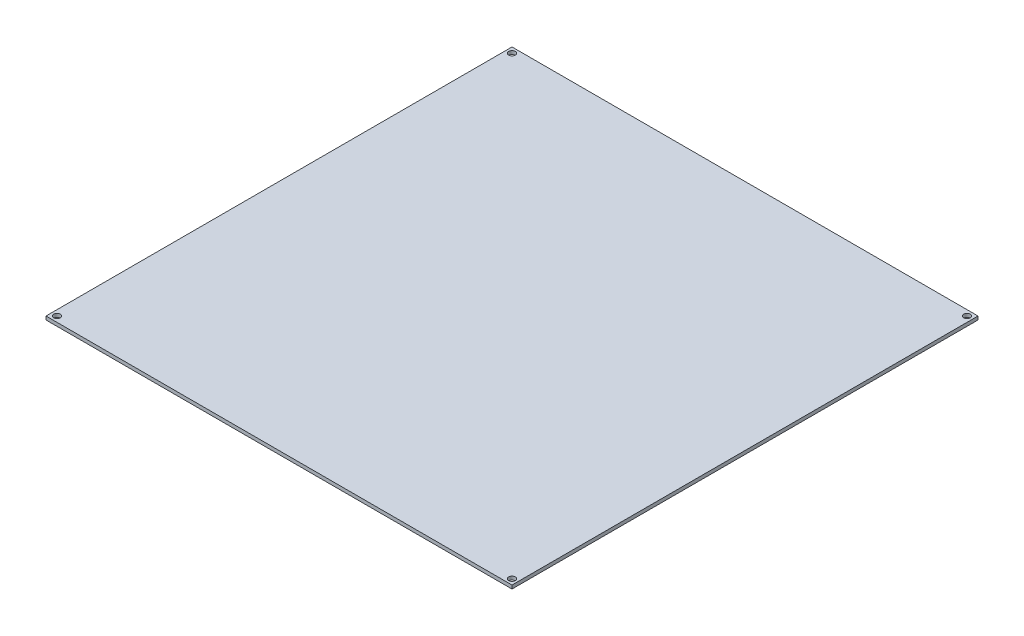
ISO-10303-21;
HEADER;
FILE_DESCRIPTION(('STEP AP214'),'2;1');
FILE_NAME('part.step','',(''),(''),'','','');
FILE_SCHEMA(('AUTOMOTIVE_DESIGN { 1 0 10303 214 1 1 1 1 }'));
ENDSEC;
DATA;
#1=APPLICATION_CONTEXT('core data for automotive mechanical design processes');
#2=APPLICATION_PROTOCOL_DEFINITION('international standard','automotive_design',2000,#1);
#3=PRODUCT_CONTEXT('',#1,'mechanical');
#4=PRODUCT('Part','Part','',(#3));
#5=PRODUCT_RELATED_PRODUCT_CATEGORY('part','',(#4));
#6=PRODUCT_DEFINITION_FORMATION('','',#4);
#7=PRODUCT_DEFINITION_CONTEXT('part definition',#1,'design');
#8=PRODUCT_DEFINITION('design','',#6,#7);
#9=PRODUCT_DEFINITION_SHAPE('','',#8);
#10=(LENGTH_UNIT() NAMED_UNIT(*) SI_UNIT(.MILLI.,.METRE.));
#11=(NAMED_UNIT(*) PLANE_ANGLE_UNIT() SI_UNIT($,.RADIAN.));
#12=(NAMED_UNIT(*) SI_UNIT($,.STERADIAN.) SOLID_ANGLE_UNIT());
#13=UNCERTAINTY_MEASURE_WITH_UNIT(LENGTH_MEASURE(1.E-05),#10,'distance_accuracy_value','');
#14=(GEOMETRIC_REPRESENTATION_CONTEXT(3) GLOBAL_UNCERTAINTY_ASSIGNED_CONTEXT((#13)) GLOBAL_UNIT_ASSIGNED_CONTEXT((#10,
#11,#12)) REPRESENTATION_CONTEXT('',''));
#15=CARTESIAN_POINT('',(0.,0.,0.));
#16=DIRECTION('',(0.,0.,1.));
#17=DIRECTION('',(1.,0.,0.));
#18=AXIS2_PLACEMENT_3D('',#15,#16,#17);
#19=CARTESIAN_POINT('',(0.,0.8,0.));
#20=DIRECTION('',(0.,1.,0.));
#21=DIRECTION('',(0.,0.,1.));
#22=AXIS2_PLACEMENT_3D('',#19,#20,#21);
#23=PLANE('',#22);
#24=CARTESIAN_POINT('',(-104.5,0.8,104.5));
#25=DIRECTION('',(0.,1.,0.));
#26=DIRECTION('',(0.,0.,-1.));
#27=AXIS2_PLACEMENT_3D('',#24,#25,#26);
#28=CIRCLE('',#27,1.5);
#29=CARTESIAN_POINT('',(-104.5,0.8,103.));
#30=VERTEX_POINT('',#29);
#31=EDGE_CURVE('E120',#30,#30,#28,.T.);
#32=ORIENTED_EDGE('',*,*,#31,.F.);
#33=EDGE_LOOP('',(#32));
#34=FACE_BOUND('',#33,.T.);
#35=CARTESIAN_POINT('',(-104.5,0.8,-104.5));
#36=DIRECTION('',(0.,1.,0.));
#37=DIRECTION('',(0.,0.,1.));
#38=AXIS2_PLACEMENT_3D('',#35,#36,#37);
#39=CIRCLE('',#38,1.5);
#40=CARTESIAN_POINT('',(-104.5,0.8,-103.));
#41=VERTEX_POINT('',#40);
#42=EDGE_CURVE('E99',#41,#41,#39,.T.);
#43=ORIENTED_EDGE('',*,*,#42,.F.);
#44=EDGE_LOOP('',(#43));
#45=FACE_BOUND('',#44,.T.);
#46=DIRECTION('',(0.,0.,1.));
#47=VECTOR('',#46,1.);
#48=CARTESIAN_POINT('',(-107.,0.8,-107.));
#49=LINE('',#48,#47);
#50=CARTESIAN_POINT('',(-107.,0.8,-107.));
#51=VERTEX_POINT('',#50);
#52=CARTESIAN_POINT('',(-107.,0.8,107.));
#53=VERTEX_POINT('',#52);
#54=EDGE_CURVE('E84',#51,#53,#49,.T.);
#55=ORIENTED_EDGE('',*,*,#54,.T.);
#56=DIRECTION('',(1.,0.,0.));
#57=VECTOR('',#56,1.);
#58=CARTESIAN_POINT('',(-107.,0.8,107.));
#59=LINE('',#58,#57);
#60=CARTESIAN_POINT('',(107.,0.8,107.));
#61=VERTEX_POINT('',#60);
#62=EDGE_CURVE('E79',#53,#61,#59,.T.);
#63=ORIENTED_EDGE('',*,*,#62,.T.);
#64=DIRECTION('',(0.,0.,-1.));
#65=VECTOR('',#64,1.);
#66=CARTESIAN_POINT('',(107.,0.8,-107.));
#67=LINE('',#66,#65);
#68=CARTESIAN_POINT('',(107.,0.8,-107.));
#69=VERTEX_POINT('',#68);
#70=EDGE_CURVE('E82',#61,#69,#67,.T.);
#71=ORIENTED_EDGE('',*,*,#70,.T.);
#72=DIRECTION('',(-1.,0.,0.));
#73=VECTOR('',#72,1.);
#74=CARTESIAN_POINT('',(-107.,0.8,-107.));
#75=LINE('',#74,#73);
#76=EDGE_CURVE('E49',#69,#51,#75,.T.);
#77=ORIENTED_EDGE('',*,*,#76,.T.);
#78=EDGE_LOOP('',(#55,#63,#71,#77));
#79=FACE_BOUND('',#78,.T.);
#80=CARTESIAN_POINT('',(104.5,0.8,-104.5));
#81=DIRECTION('',(0.,1.,0.));
#82=DIRECTION('',(0.,0.,-1.));
#83=AXIS2_PLACEMENT_3D('',#80,#81,#82);
#84=CIRCLE('',#83,1.5);
#85=CARTESIAN_POINT('',(104.5,0.8,-106.));
#86=VERTEX_POINT('',#85);
#87=EDGE_CURVE('E114',#86,#86,#84,.T.);
#88=ORIENTED_EDGE('',*,*,#87,.F.);
#89=EDGE_LOOP('',(#88));
#90=FACE_BOUND('',#89,.T.);
#91=CARTESIAN_POINT('',(104.5,0.8,104.5));
#92=DIRECTION('',(0.,1.,0.));
#93=DIRECTION('',(0.,0.,1.));
#94=AXIS2_PLACEMENT_3D('',#91,#92,#93);
#95=CIRCLE('',#94,1.5);
#96=CARTESIAN_POINT('',(104.5,0.8,106.));
#97=VERTEX_POINT('',#96);
#98=EDGE_CURVE('E126',#97,#97,#95,.T.);
#99=ORIENTED_EDGE('',*,*,#98,.F.);
#100=EDGE_LOOP('',(#99));
#101=FACE_BOUND('',#100,.T.);
#102=ADVANCED_FACE('F32',(#34,#45,#79,#90,#101),#23,.T.);
#103=CARTESIAN_POINT('',(0.,-0.8,0.));
#104=DIRECTION('',(0.,1.,0.));
#105=DIRECTION('',(0.,0.,1.));
#106=AXIS2_PLACEMENT_3D('',#103,#104,#105);
#107=PLANE('',#106);
#108=DIRECTION('',(0.,0.,1.));
#109=VECTOR('',#108,1.);
#110=CARTESIAN_POINT('',(-107.,-0.8,-107.));
#111=LINE('',#110,#109);
#112=CARTESIAN_POINT('',(-107.,-0.8,-107.));
#113=VERTEX_POINT('',#112);
#114=CARTESIAN_POINT('',(-107.,-0.8,107.));
#115=VERTEX_POINT('',#114);
#116=EDGE_CURVE('E96',#113,#115,#111,.T.);
#117=ORIENTED_EDGE('',*,*,#116,.F.);
#118=DIRECTION('',(-1.,0.,0.));
#119=VECTOR('',#118,1.);
#120=CARTESIAN_POINT('',(-107.,-0.8,-107.));
#121=LINE('',#120,#119);
#122=CARTESIAN_POINT('',(107.,-0.8,-107.));
#123=VERTEX_POINT('',#122);
#124=EDGE_CURVE('E72',#123,#113,#121,.T.);
#125=ORIENTED_EDGE('',*,*,#124,.F.);
#126=DIRECTION('',(0.,0.,-1.));
#127=VECTOR('',#126,1.);
#128=CARTESIAN_POINT('',(107.,-0.8,-107.));
#129=LINE('',#128,#127);
#130=CARTESIAN_POINT('',(107.,-0.8,107.));
#131=VERTEX_POINT('',#130);
#132=EDGE_CURVE('E66',#131,#123,#129,.T.);
#133=ORIENTED_EDGE('',*,*,#132,.F.);
#134=DIRECTION('',(1.,0.,0.));
#135=VECTOR('',#134,1.);
#136=CARTESIAN_POINT('',(-107.,-0.8,107.));
#137=LINE('',#136,#135);
#138=EDGE_CURVE('E88',#115,#131,#137,.T.);
#139=ORIENTED_EDGE('',*,*,#138,.F.);
#140=EDGE_LOOP('',(#117,#125,#133,#139));
#141=FACE_BOUND('',#140,.T.);
#142=CARTESIAN_POINT('',(-104.5,-0.8,-104.5));
#143=DIRECTION('',(0.,1.,0.));
#144=DIRECTION('',(0.,0.,1.));
#145=AXIS2_PLACEMENT_3D('',#142,#143,#144);
#146=CIRCLE('',#145,1.5);
#147=CARTESIAN_POINT('',(-104.5,-0.8,-103.));
#148=VERTEX_POINT('',#147);
#149=EDGE_CURVE('E111',#148,#148,#146,.T.);
#150=ORIENTED_EDGE('',*,*,#149,.T.);
#151=EDGE_LOOP('',(#150));
#152=FACE_BOUND('',#151,.T.);
#153=CARTESIAN_POINT('',(104.5,-0.8,-104.5));
#154=DIRECTION('',(0.,1.,0.));
#155=DIRECTION('',(0.,0.,-1.));
#156=AXIS2_PLACEMENT_3D('',#153,#154,#155);
#157=CIRCLE('',#156,1.5);
#158=CARTESIAN_POINT('',(104.5,-0.8,-106.));
#159=VERTEX_POINT('',#158);
#160=EDGE_CURVE('E117',#159,#159,#157,.T.);
#161=ORIENTED_EDGE('',*,*,#160,.T.);
#162=EDGE_LOOP('',(#161));
#163=FACE_BOUND('',#162,.T.);
#164=CARTESIAN_POINT('',(-104.5,-0.8,104.5));
#165=DIRECTION('',(0.,1.,0.));
#166=DIRECTION('',(0.,0.,-1.));
#167=AXIS2_PLACEMENT_3D('',#164,#165,#166);
#168=CIRCLE('',#167,1.5);
#169=CARTESIAN_POINT('',(-104.5,-0.8,103.));
#170=VERTEX_POINT('',#169);
#171=EDGE_CURVE('E123',#170,#170,#168,.T.);
#172=ORIENTED_EDGE('',*,*,#171,.T.);
#173=EDGE_LOOP('',(#172));
#174=FACE_BOUND('',#173,.T.);
#175=CARTESIAN_POINT('',(104.5,-0.8,104.5));
#176=DIRECTION('',(0.,1.,0.));
#177=DIRECTION('',(0.,0.,1.));
#178=AXIS2_PLACEMENT_3D('',#175,#176,#177);
#179=CIRCLE('',#178,1.5);
#180=CARTESIAN_POINT('',(104.5,-0.8,106.));
#181=VERTEX_POINT('',#180);
#182=EDGE_CURVE('E129',#181,#181,#179,.T.);
#183=ORIENTED_EDGE('',*,*,#182,.T.);
#184=EDGE_LOOP('',(#183));
#185=FACE_BOUND('',#184,.T.);
#186=ADVANCED_FACE('F107',(#141,#152,#163,#174,#185),#107,.F.);
#187=CARTESIAN_POINT('',(-107.,0.8,-107.));
#188=DIRECTION('',(1.,0.,0.));
#189=DIRECTION('',(0.,0.,-1.));
#190=AXIS2_PLACEMENT_3D('',#187,#188,#189);
#191=PLANE('',#190);
#192=ORIENTED_EDGE('',*,*,#116,.T.);
#193=DIRECTION('',(0.,-1.,0.));
#194=VECTOR('',#193,1.);
#195=CARTESIAN_POINT('',(-107.,0.8,107.));
#196=LINE('',#195,#194);
#197=EDGE_CURVE('E11',#53,#115,#196,.T.);
#198=ORIENTED_EDGE('',*,*,#197,.F.);
#199=ORIENTED_EDGE('',*,*,#54,.F.);
#200=DIRECTION('',(0.,-1.,0.));
#201=VECTOR('',#200,1.);
#202=CARTESIAN_POINT('',(-107.,0.8,-107.));
#203=LINE('',#202,#201);
#204=EDGE_CURVE('E92',#51,#113,#203,.T.);
#205=ORIENTED_EDGE('',*,*,#204,.T.);
#206=EDGE_LOOP('',(#192,#198,#199,#205));
#207=FACE_BOUND('',#206,.T.);
#208=ADVANCED_FACE('F34',(#207),#191,.F.);
#209=CARTESIAN_POINT('',(-107.,0.8,107.));
#210=DIRECTION('',(0.,0.,-1.));
#211=DIRECTION('',(-1.,0.,0.));
#212=AXIS2_PLACEMENT_3D('',#209,#210,#211);
#213=PLANE('',#212);
#214=ORIENTED_EDGE('',*,*,#138,.T.);
#215=DIRECTION('',(0.,-1.,0.));
#216=VECTOR('',#215,1.);
#217=CARTESIAN_POINT('',(107.,0.8,107.));
#218=LINE('',#217,#216);
#219=EDGE_CURVE('E41',#61,#131,#218,.T.);
#220=ORIENTED_EDGE('',*,*,#219,.F.);
#221=ORIENTED_EDGE('',*,*,#62,.F.);
#222=ORIENTED_EDGE('',*,*,#197,.T.);
#223=EDGE_LOOP('',(#214,#220,#221,#222));
#224=FACE_BOUND('',#223,.T.);
#225=ADVANCED_FACE('F87',(#224),#213,.F.);
#226=CARTESIAN_POINT('',(107.,0.8,-107.));
#227=DIRECTION('',(-1.,0.,0.));
#228=DIRECTION('',(0.,0.,1.));
#229=AXIS2_PLACEMENT_3D('',#226,#227,#228);
#230=PLANE('',#229);
#231=ORIENTED_EDGE('',*,*,#132,.T.);
#232=DIRECTION('',(0.,-1.,0.));
#233=VECTOR('',#232,1.);
#234=CARTESIAN_POINT('',(107.,0.8,-107.));
#235=LINE('',#234,#233);
#236=EDGE_CURVE('E89',#69,#123,#235,.T.);
#237=ORIENTED_EDGE('',*,*,#236,.F.);
#238=ORIENTED_EDGE('',*,*,#70,.F.);
#239=ORIENTED_EDGE('',*,*,#219,.T.);
#240=EDGE_LOOP('',(#231,#237,#238,#239));
#241=FACE_BOUND('',#240,.T.);
#242=ADVANCED_FACE('F90',(#241),#230,.F.);
#243=CARTESIAN_POINT('',(-107.,0.8,-107.));
#244=DIRECTION('',(0.,0.,1.));
#245=DIRECTION('',(1.,0.,0.));
#246=AXIS2_PLACEMENT_3D('',#243,#244,#245);
#247=PLANE('',#246);
#248=ORIENTED_EDGE('',*,*,#124,.T.);
#249=ORIENTED_EDGE('',*,*,#204,.F.);
#250=ORIENTED_EDGE('',*,*,#76,.F.);
#251=ORIENTED_EDGE('',*,*,#236,.T.);
#252=EDGE_LOOP('',(#248,#249,#250,#251));
#253=FACE_BOUND('',#252,.T.);
#254=ADVANCED_FACE('F104',(#253),#247,.F.);
#255=CARTESIAN_POINT('',(-104.5,0.8,-104.5));
#256=DIRECTION('',(0.,-1.,0.));
#257=DIRECTION('',(0.,0.,-1.));
#258=AXIS2_PLACEMENT_3D('',#255,#256,#257);
#259=CYLINDRICAL_SURFACE('',#258,1.5);
#260=ORIENTED_EDGE('',*,*,#42,.T.);
#261=EDGE_LOOP('',(#260));
#262=FACE_BOUND('',#261,.T.);
#263=ORIENTED_EDGE('',*,*,#149,.F.);
#264=EDGE_LOOP('',(#263));
#265=FACE_BOUND('',#264,.T.);
#266=ADVANCED_FACE('F148',(#262,#265),#259,.F.);
#267=CARTESIAN_POINT('',(104.5,0.8,-104.5));
#268=DIRECTION('',(0.,-1.,0.));
#269=DIRECTION('',(0.,0.,-1.));
#270=AXIS2_PLACEMENT_3D('',#267,#268,#269);
#271=CYLINDRICAL_SURFACE('',#270,1.5);
#272=ORIENTED_EDGE('',*,*,#87,.T.);
#273=EDGE_LOOP('',(#272));
#274=FACE_BOUND('',#273,.T.);
#275=ORIENTED_EDGE('',*,*,#160,.F.);
#276=EDGE_LOOP('',(#275));
#277=FACE_BOUND('',#276,.T.);
#278=ADVANCED_FACE('F194',(#274,#277),#271,.F.);
#279=CARTESIAN_POINT('',(-104.5,0.8,104.5));
#280=DIRECTION('',(0.,-1.,0.));
#281=DIRECTION('',(0.,0.,-1.));
#282=AXIS2_PLACEMENT_3D('',#279,#280,#281);
#283=CYLINDRICAL_SURFACE('',#282,1.5);
#284=ORIENTED_EDGE('',*,*,#31,.T.);
#285=EDGE_LOOP('',(#284));
#286=FACE_BOUND('',#285,.T.);
#287=ORIENTED_EDGE('',*,*,#171,.F.);
#288=EDGE_LOOP('',(#287));
#289=FACE_BOUND('',#288,.T.);
#290=ADVANCED_FACE('F202',(#286,#289),#283,.F.);
#291=CARTESIAN_POINT('',(104.5,0.8,104.5));
#292=DIRECTION('',(0.,-1.,0.));
#293=DIRECTION('',(0.,0.,-1.));
#294=AXIS2_PLACEMENT_3D('',#291,#292,#293);
#295=CYLINDRICAL_SURFACE('',#294,1.5);
#296=ORIENTED_EDGE('',*,*,#98,.T.);
#297=EDGE_LOOP('',(#296));
#298=FACE_BOUND('',#297,.T.);
#299=ORIENTED_EDGE('',*,*,#182,.F.);
#300=EDGE_LOOP('',(#299));
#301=FACE_BOUND('',#300,.T.);
#302=ADVANCED_FACE('F135',(#298,#301),#295,.F.);
#303=CLOSED_SHELL('',(#102,#186,#208,#225,#242,#254,#266,#278,#290,#302));
#304=MANIFOLD_SOLID_BREP('B2',#303);
#305=ADVANCED_BREP_SHAPE_REPRESENTATION('',(#18,#304),#14);
#306=SHAPE_DEFINITION_REPRESENTATION(#9,#305);
ENDSEC;
END-ISO-10303-21;
